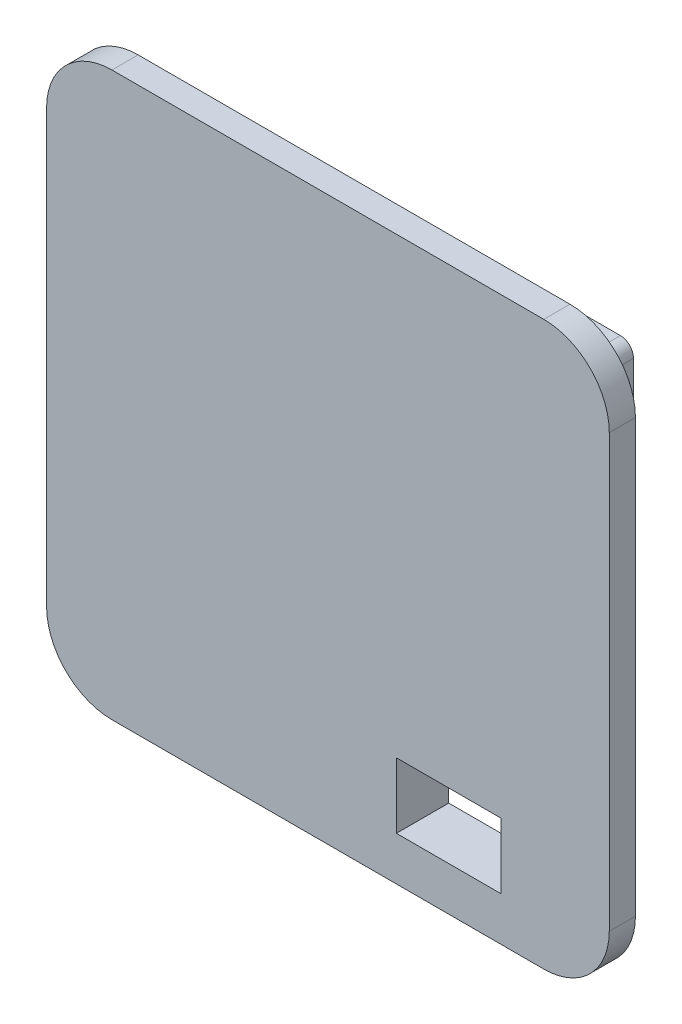
ISO-10303-21;
HEADER;
FILE_DESCRIPTION(('STEP AP214'),'2;1');
FILE_NAME('part.step','',(''),(''),'','','');
FILE_SCHEMA(('AUTOMOTIVE_DESIGN { 1 0 10303 214 1 1 1 1 }'));
ENDSEC;
DATA;
#1=APPLICATION_CONTEXT('core data for automotive mechanical design processes');
#2=APPLICATION_PROTOCOL_DEFINITION('international standard','automotive_design',2000,#1);
#3=PRODUCT_CONTEXT('',#1,'mechanical');
#4=PRODUCT('Part','Part','',(#3));
#5=PRODUCT_RELATED_PRODUCT_CATEGORY('part','',(#4));
#6=PRODUCT_DEFINITION_FORMATION('','',#4);
#7=PRODUCT_DEFINITION_CONTEXT('part definition',#1,'design');
#8=PRODUCT_DEFINITION('design','',#6,#7);
#9=PRODUCT_DEFINITION_SHAPE('','',#8);
#10=(LENGTH_UNIT() NAMED_UNIT(*) SI_UNIT(.MILLI.,.METRE.));
#11=(NAMED_UNIT(*) PLANE_ANGLE_UNIT() SI_UNIT($,.RADIAN.));
#12=(NAMED_UNIT(*) SI_UNIT($,.STERADIAN.) SOLID_ANGLE_UNIT());
#13=UNCERTAINTY_MEASURE_WITH_UNIT(LENGTH_MEASURE(1.E-05),#10,'distance_accuracy_value','');
#14=(GEOMETRIC_REPRESENTATION_CONTEXT(3) GLOBAL_UNCERTAINTY_ASSIGNED_CONTEXT((#13)) GLOBAL_UNIT_ASSIGNED_CONTEXT((#10,
#11,#12)) REPRESENTATION_CONTEXT('',''));
#15=CARTESIAN_POINT('',(0.,0.,0.));
#16=DIRECTION('',(0.,0.,1.));
#17=DIRECTION('',(1.,0.,0.));
#18=AXIS2_PLACEMENT_3D('',#15,#16,#17);
#19=CARTESIAN_POINT('',(21.5,-21.500000053,2.));
#20=DIRECTION('',(0.,1.,0.));
#21=DIRECTION('',(0.,0.,1.));
#22=AXIS2_PLACEMENT_3D('',#19,#20,#21);
#23=PLANE('',#22);
#24=DIRECTION('',(1.,0.,0.));
#25=VECTOR('',#24,1.);
#26=CARTESIAN_POINT('',(21.5,-21.500000053,0.));
#27=LINE('',#26,#25);
#28=CARTESIAN_POINT('',(-16.5,-21.500000053,0.));
#29=VERTEX_POINT('',#28);
#30=CARTESIAN_POINT('',(16.5,-21.500000053,0.));
#31=VERTEX_POINT('',#30);
#32=EDGE_CURVE('E231',#29,#31,#27,.T.);
#33=ORIENTED_EDGE('',*,*,#32,.T.);
#34=DIRECTION('',(0.,0.,-1.));
#35=VECTOR('',#34,1.);
#36=CARTESIAN_POINT('',(16.5,-21.500000053,2.));
#37=LINE('',#36,#35);
#38=CARTESIAN_POINT('',(16.5,-21.500000053,2.));
#39=VERTEX_POINT('',#38);
#40=EDGE_CURVE('E274',#31,#39,#37,.F.);
#41=ORIENTED_EDGE('',*,*,#40,.T.);
#42=DIRECTION('',(1.,0.,0.));
#43=VECTOR('',#42,1.);
#44=CARTESIAN_POINT('',(21.5,-21.500000053,2.));
#45=LINE('',#44,#43);
#46=CARTESIAN_POINT('',(-16.5,-21.500000053,2.));
#47=VERTEX_POINT('',#46);
#48=EDGE_CURVE('E237',#47,#39,#45,.T.);
#49=ORIENTED_EDGE('',*,*,#48,.F.);
#50=DIRECTION('',(0.,0.,-1.));
#51=VECTOR('',#50,1.);
#52=CARTESIAN_POINT('',(-16.5,-21.500000053,2.));
#53=LINE('',#52,#51);
#54=EDGE_CURVE('E275',#47,#29,#53,.T.);
#55=ORIENTED_EDGE('',*,*,#54,.T.);
#56=EDGE_LOOP('',(#33,#41,#49,#55));
#57=FACE_BOUND('',#56,.T.);
#58=ADVANCED_FACE('F41',(#57),#23,.F.);
#59=CARTESIAN_POINT('',(21.5,21.500000053,2.));
#60=DIRECTION('',(-1.,0.,0.));
#61=DIRECTION('',(0.,-1.,0.));
#62=AXIS2_PLACEMENT_3D('',#59,#60,#61);
#63=PLANE('',#62);
#64=DIRECTION('',(0.,1.,0.));
#65=VECTOR('',#64,1.);
#66=CARTESIAN_POINT('',(21.5,21.500000053,2.));
#67=LINE('',#66,#65);
#68=CARTESIAN_POINT('',(21.5,-16.500000053,2.));
#69=VERTEX_POINT('',#68);
#70=CARTESIAN_POINT('',(21.5,16.500000053,2.));
#71=VERTEX_POINT('',#70);
#72=EDGE_CURVE('E239',#69,#71,#67,.T.);
#73=ORIENTED_EDGE('',*,*,#72,.F.);
#74=DIRECTION('',(0.,0.,-1.));
#75=VECTOR('',#74,1.);
#76=CARTESIAN_POINT('',(21.5,-16.500000053,2.));
#77=LINE('',#76,#75);
#78=CARTESIAN_POINT('',(21.5,-16.500000053,0.));
#79=VERTEX_POINT('',#78);
#80=EDGE_CURVE('E261',#69,#79,#77,.T.);
#81=ORIENTED_EDGE('',*,*,#80,.T.);
#82=DIRECTION('',(0.,1.,0.));
#83=VECTOR('',#82,1.);
#84=CARTESIAN_POINT('',(21.5,21.500000053,0.));
#85=LINE('',#84,#83);
#86=CARTESIAN_POINT('',(21.5,16.500000053,0.));
#87=VERTEX_POINT('',#86);
#88=EDGE_CURVE('E252',#79,#87,#85,.T.);
#89=ORIENTED_EDGE('',*,*,#88,.T.);
#90=DIRECTION('',(0.,0.,-1.));
#91=VECTOR('',#90,1.);
#92=CARTESIAN_POINT('',(21.5,16.500000053,2.));
#93=LINE('',#92,#91);
#94=EDGE_CURVE('E248',#87,#71,#93,.F.);
#95=ORIENTED_EDGE('',*,*,#94,.T.);
#96=EDGE_LOOP('',(#73,#81,#89,#95));
#97=FACE_BOUND('',#96,.T.);
#98=ADVANCED_FACE('F374',(#97),#63,.F.);
#99=CARTESIAN_POINT('',(21.5,21.500000053,2.));
#100=DIRECTION('',(0.,-1.,0.));
#101=DIRECTION('',(0.,0.,-1.));
#102=AXIS2_PLACEMENT_3D('',#99,#100,#101);
#103=PLANE('',#102);
#104=DIRECTION('',(-1.,0.,0.));
#105=VECTOR('',#104,1.);
#106=CARTESIAN_POINT('',(21.5,21.500000053,0.));
#107=LINE('',#106,#105);
#108=CARTESIAN_POINT('',(16.5,21.500000053,0.));
#109=VERTEX_POINT('',#108);
#110=CARTESIAN_POINT('',(-16.5,21.500000053,0.));
#111=VERTEX_POINT('',#110);
#112=EDGE_CURVE('E254',#109,#111,#107,.T.);
#113=ORIENTED_EDGE('',*,*,#112,.T.);
#114=DIRECTION('',(0.,0.,-1.));
#115=VECTOR('',#114,1.);
#116=CARTESIAN_POINT('',(-16.5,21.500000053,2.));
#117=LINE('',#116,#115);
#118=CARTESIAN_POINT('',(-16.5,21.500000053,2.));
#119=VERTEX_POINT('',#118);
#120=EDGE_CURVE('E291',#111,#119,#117,.F.);
#121=ORIENTED_EDGE('',*,*,#120,.T.);
#122=DIRECTION('',(-1.,0.,0.));
#123=VECTOR('',#122,1.);
#124=CARTESIAN_POINT('',(21.5,21.500000053,2.));
#125=LINE('',#124,#123);
#126=CARTESIAN_POINT('',(16.5,21.500000053,2.));
#127=VERTEX_POINT('',#126);
#128=EDGE_CURVE('E241',#127,#119,#125,.T.);
#129=ORIENTED_EDGE('',*,*,#128,.F.);
#130=DIRECTION('',(0.,0.,-1.));
#131=VECTOR('',#130,1.);
#132=CARTESIAN_POINT('',(16.5,21.500000053,2.));
#133=LINE('',#132,#131);
#134=EDGE_CURVE('E289',#127,#109,#133,.T.);
#135=ORIENTED_EDGE('',*,*,#134,.T.);
#136=EDGE_LOOP('',(#113,#121,#129,#135));
#137=FACE_BOUND('',#136,.T.);
#138=ADVANCED_FACE('F381',(#137),#103,.F.);
#139=CARTESIAN_POINT('',(-21.5,21.500000053,2.));
#140=DIRECTION('',(1.,0.,0.));
#141=DIRECTION('',(0.,1.,0.));
#142=AXIS2_PLACEMENT_3D('',#139,#140,#141);
#143=PLANE('',#142);
#144=DIRECTION('',(0.,-1.,0.));
#145=VECTOR('',#144,1.);
#146=CARTESIAN_POINT('',(-21.5,21.500000053,0.));
#147=LINE('',#146,#145);
#148=CARTESIAN_POINT('',(-21.5,16.500000053,0.));
#149=VERTEX_POINT('',#148);
#150=CARTESIAN_POINT('',(-21.5,-16.500000053,0.));
#151=VERTEX_POINT('',#150);
#152=EDGE_CURVE('E238',#149,#151,#147,.T.);
#153=ORIENTED_EDGE('',*,*,#152,.T.);
#154=DIRECTION('',(0.,0.,-1.));
#155=VECTOR('',#154,1.);
#156=CARTESIAN_POINT('',(-21.5,-16.500000053,2.));
#157=LINE('',#156,#155);
#158=CARTESIAN_POINT('',(-21.5,-16.500000053,2.));
#159=VERTEX_POINT('',#158);
#160=EDGE_CURVE('E287',#151,#159,#157,.F.);
#161=ORIENTED_EDGE('',*,*,#160,.T.);
#162=DIRECTION('',(0.,-1.,0.));
#163=VECTOR('',#162,1.);
#164=CARTESIAN_POINT('',(-21.5,21.500000053,2.));
#165=LINE('',#164,#163);
#166=CARTESIAN_POINT('',(-21.5,16.500000053,2.));
#167=VERTEX_POINT('',#166);
#168=EDGE_CURVE('E246',#167,#159,#165,.T.);
#169=ORIENTED_EDGE('',*,*,#168,.F.);
#170=DIRECTION('',(0.,0.,-1.));
#171=VECTOR('',#170,1.);
#172=CARTESIAN_POINT('',(-21.5,16.500000053,2.));
#173=LINE('',#172,#171);
#174=EDGE_CURVE('E282',#167,#149,#173,.T.);
#175=ORIENTED_EDGE('',*,*,#174,.T.);
#176=EDGE_LOOP('',(#153,#161,#169,#175));
#177=FACE_BOUND('',#176,.T.);
#178=ADVANCED_FACE('F425',(#177),#143,.F.);
#179=CARTESIAN_POINT('',(0.,0.,2.));
#180=DIRECTION('',(0.,0.,1.));
#181=DIRECTION('',(1.,0.,0.));
#182=AXIS2_PLACEMENT_3D('',#179,#180,#181);
#183=PLANE('',#182);
#184=DIRECTION('',(0.,-1.,0.));
#185=VECTOR('',#184,1.);
#186=CARTESIAN_POINT('',(5.23212130139682,-18.14808421376,2.));
#187=LINE('',#186,#185);
#188=CARTESIAN_POINT('',(5.23212130139682,-13.14808421376,2.));
#189=VERTEX_POINT('',#188);
#190=CARTESIAN_POINT('',(5.23212130139682,-18.14808421376,2.));
#191=VERTEX_POINT('',#190);
#192=EDGE_CURVE('E211',#189,#191,#187,.T.);
#193=ORIENTED_EDGE('',*,*,#192,.F.);
#194=DIRECTION('',(-1.,0.,0.));
#195=VECTOR('',#194,1.);
#196=CARTESIAN_POINT('',(13.2321213013968,-13.14808421376,2.));
#197=LINE('',#196,#195);
#198=CARTESIAN_POINT('',(13.2321213013968,-13.14808421376,2.));
#199=VERTEX_POINT('',#198);
#200=EDGE_CURVE('E226',#199,#189,#197,.T.);
#201=ORIENTED_EDGE('',*,*,#200,.F.);
#202=DIRECTION('',(0.,1.,0.));
#203=VECTOR('',#202,1.);
#204=CARTESIAN_POINT('',(13.2321213013968,-18.14808421376,2.));
#205=LINE('',#204,#203);
#206=CARTESIAN_POINT('',(13.2321213013968,-18.14808421376,2.));
#207=VERTEX_POINT('',#206);
#208=EDGE_CURVE('E181',#207,#199,#205,.T.);
#209=ORIENTED_EDGE('',*,*,#208,.F.);
#210=DIRECTION('',(1.,0.,0.));
#211=VECTOR('',#210,1.);
#212=CARTESIAN_POINT('',(13.2321213013968,-18.14808421376,2.));
#213=LINE('',#212,#211);
#214=EDGE_CURVE('E221',#191,#207,#213,.T.);
#215=ORIENTED_EDGE('',*,*,#214,.F.);
#216=EDGE_LOOP('',(#193,#201,#209,#215));
#217=FACE_BOUND('',#216,.T.);
#218=ORIENTED_EDGE('',*,*,#48,.T.);
#219=CARTESIAN_POINT('',(16.5,-16.500000053,2.));
#220=DIRECTION('',(0.,0.,1.));
#221=DIRECTION('',(1.,0.,0.));
#222=AXIS2_PLACEMENT_3D('',#219,#220,#221);
#223=CIRCLE('',#222,5.);
#224=EDGE_CURVE('E281',#39,#69,#223,.T.);
#225=ORIENTED_EDGE('',*,*,#224,.T.);
#226=ORIENTED_EDGE('',*,*,#72,.T.);
#227=CARTESIAN_POINT('',(16.5,16.500000053,2.));
#228=DIRECTION('',(0.,0.,1.));
#229=DIRECTION('',(1.,0.,0.));
#230=AXIS2_PLACEMENT_3D('',#227,#228,#229);
#231=CIRCLE('',#230,5.);
#232=EDGE_CURVE('E280',#71,#127,#231,.T.);
#233=ORIENTED_EDGE('',*,*,#232,.T.);
#234=ORIENTED_EDGE('',*,*,#128,.T.);
#235=CARTESIAN_POINT('',(-16.5,16.500000053,2.));
#236=DIRECTION('',(0.,0.,1.));
#237=DIRECTION('',(1.,0.,0.));
#238=AXIS2_PLACEMENT_3D('',#235,#236,#237);
#239=CIRCLE('',#238,5.);
#240=EDGE_CURVE('E276',#119,#167,#239,.T.);
#241=ORIENTED_EDGE('',*,*,#240,.T.);
#242=ORIENTED_EDGE('',*,*,#168,.T.);
#243=CARTESIAN_POINT('',(-16.5,-16.500000053,2.));
#244=DIRECTION('',(0.,0.,1.));
#245=DIRECTION('',(1.,0.,0.));
#246=AXIS2_PLACEMENT_3D('',#243,#244,#245);
#247=CIRCLE('',#246,5.);
#248=EDGE_CURVE('E283',#159,#47,#247,.T.);
#249=ORIENTED_EDGE('',*,*,#248,.T.);
#250=EDGE_LOOP('',(#218,#225,#226,#233,#234,#241,#242,#249));
#251=FACE_BOUND('',#250,.T.);
#252=ADVANCED_FACE('F415',(#217,#251),#183,.T.);
#253=CARTESIAN_POINT('',(0.,0.,0.));
#254=DIRECTION('',(0.,0.,1.));
#255=DIRECTION('',(1.,0.,0.));
#256=AXIS2_PLACEMENT_3D('',#253,#254,#255);
#257=PLANE('',#256);
#258=DIRECTION('',(1.,0.,0.));
#259=VECTOR('',#258,1.);
#260=CARTESIAN_POINT('',(0.,19.35,0.));
#261=LINE('',#260,#259);
#262=CARTESIAN_POINT('',(-18.35,19.35,0.));
#263=VERTEX_POINT('',#262);
#264=CARTESIAN_POINT('',(18.35,19.35,0.));
#265=VERTEX_POINT('',#264);
#266=EDGE_CURVE('E212',#263,#265,#261,.T.);
#267=ORIENTED_EDGE('',*,*,#266,.F.);
#268=CARTESIAN_POINT('',(-18.35,18.35,0.));
#269=DIRECTION('',(0.,0.,1.));
#270=DIRECTION('',(1.,0.,0.));
#271=AXIS2_PLACEMENT_3D('',#268,#269,#270);
#272=CIRCLE('',#271,1.);
#273=CARTESIAN_POINT('',(-19.35,18.35,0.));
#274=VERTEX_POINT('',#273);
#275=EDGE_CURVE('E325',#263,#274,#272,.T.);
#276=ORIENTED_EDGE('',*,*,#275,.T.);
#277=DIRECTION('',(0.,-1.,0.));
#278=VECTOR('',#277,1.);
#279=CARTESIAN_POINT('',(-19.35,0.,0.));
#280=LINE('',#279,#278);
#281=CARTESIAN_POINT('',(-19.35,-18.35,0.));
#282=VERTEX_POINT('',#281);
#283=EDGE_CURVE('E215',#274,#282,#280,.T.);
#284=ORIENTED_EDGE('',*,*,#283,.T.);
#285=CARTESIAN_POINT('',(-18.35,-18.35,0.));
#286=DIRECTION('',(0.,0.,1.));
#287=DIRECTION('',(1.,0.,0.));
#288=AXIS2_PLACEMENT_3D('',#285,#286,#287);
#289=CIRCLE('',#288,1.);
#290=CARTESIAN_POINT('',(-18.35,-19.35,0.));
#291=VERTEX_POINT('',#290);
#292=EDGE_CURVE('E11',#282,#291,#289,.T.);
#293=ORIENTED_EDGE('',*,*,#292,.T.);
#294=DIRECTION('',(1.,0.,0.));
#295=VECTOR('',#294,1.);
#296=CARTESIAN_POINT('',(0.,-19.35,0.));
#297=LINE('',#296,#295);
#298=CARTESIAN_POINT('',(18.35,-19.35,0.));
#299=VERTEX_POINT('',#298);
#300=EDGE_CURVE('E219',#291,#299,#297,.T.);
#301=ORIENTED_EDGE('',*,*,#300,.T.);
#302=CARTESIAN_POINT('',(18.35,-18.35,0.));
#303=DIRECTION('',(0.,0.,1.));
#304=DIRECTION('',(1.,0.,0.));
#305=AXIS2_PLACEMENT_3D('',#302,#303,#304);
#306=CIRCLE('',#305,1.);
#307=CARTESIAN_POINT('',(19.35,-18.35,0.));
#308=VERTEX_POINT('',#307);
#309=EDGE_CURVE('E47',#299,#308,#306,.T.);
#310=ORIENTED_EDGE('',*,*,#309,.T.);
#311=DIRECTION('',(0.,-1.,0.));
#312=VECTOR('',#311,1.);
#313=CARTESIAN_POINT('',(19.35,0.,0.));
#314=LINE('',#313,#312);
#315=CARTESIAN_POINT('',(19.35,18.35,0.));
#316=VERTEX_POINT('',#315);
#317=EDGE_CURVE('E220',#316,#308,#314,.T.);
#318=ORIENTED_EDGE('',*,*,#317,.F.);
#319=CARTESIAN_POINT('',(18.35,18.35,0.));
#320=DIRECTION('',(0.,0.,1.));
#321=DIRECTION('',(1.,0.,0.));
#322=AXIS2_PLACEMENT_3D('',#319,#320,#321);
#323=CIRCLE('',#322,1.);
#324=EDGE_CURVE('E322',#316,#265,#323,.T.);
#325=ORIENTED_EDGE('',*,*,#324,.T.);
#326=EDGE_LOOP('',(#267,#276,#284,#293,#301,#310,#318,#325));
#327=FACE_BOUND('',#326,.T.);
#328=ORIENTED_EDGE('',*,*,#88,.F.);
#329=CARTESIAN_POINT('',(16.5,-16.500000053,0.));
#330=DIRECTION('',(0.,0.,1.));
#331=DIRECTION('',(1.,0.,0.));
#332=AXIS2_PLACEMENT_3D('',#329,#330,#331);
#333=CIRCLE('',#332,5.);
#334=EDGE_CURVE('E269',#79,#31,#333,.F.);
#335=ORIENTED_EDGE('',*,*,#334,.T.);
#336=ORIENTED_EDGE('',*,*,#32,.F.);
#337=CARTESIAN_POINT('',(-16.5,-16.500000053,0.));
#338=DIRECTION('',(0.,0.,1.));
#339=DIRECTION('',(1.,0.,0.));
#340=AXIS2_PLACEMENT_3D('',#337,#338,#339);
#341=CIRCLE('',#340,5.);
#342=EDGE_CURVE('E268',#29,#151,#341,.F.);
#343=ORIENTED_EDGE('',*,*,#342,.T.);
#344=ORIENTED_EDGE('',*,*,#152,.F.);
#345=CARTESIAN_POINT('',(-16.5,16.500000053,0.));
#346=DIRECTION('',(0.,0.,1.));
#347=DIRECTION('',(1.,0.,0.));
#348=AXIS2_PLACEMENT_3D('',#345,#346,#347);
#349=CIRCLE('',#348,5.);
#350=EDGE_CURVE('E266',#149,#111,#349,.F.);
#351=ORIENTED_EDGE('',*,*,#350,.T.);
#352=ORIENTED_EDGE('',*,*,#112,.F.);
#353=CARTESIAN_POINT('',(16.5,16.500000053,0.));
#354=DIRECTION('',(0.,0.,1.));
#355=DIRECTION('',(1.,0.,0.));
#356=AXIS2_PLACEMENT_3D('',#353,#354,#355);
#357=CIRCLE('',#356,5.);
#358=EDGE_CURVE('E262',#109,#87,#357,.F.);
#359=ORIENTED_EDGE('',*,*,#358,.T.);
#360=EDGE_LOOP('',(#328,#335,#336,#343,#344,#351,#352,#359));
#361=FACE_BOUND('',#360,.T.);
#362=ADVANCED_FACE('F330',(#327,#361),#257,.F.);
#363=CARTESIAN_POINT('',(16.5,-16.500000053,2.));
#364=DIRECTION('',(0.,0.,-1.));
#365=DIRECTION('',(-1.,0.,0.));
#366=AXIS2_PLACEMENT_3D('',#363,#364,#365);
#367=CYLINDRICAL_SURFACE('',#366,5.);
#368=ORIENTED_EDGE('',*,*,#224,.F.);
#369=ORIENTED_EDGE('',*,*,#40,.F.);
#370=ORIENTED_EDGE('',*,*,#334,.F.);
#371=ORIENTED_EDGE('',*,*,#80,.F.);
#372=EDGE_LOOP('',(#368,#369,#370,#371));
#373=FACE_BOUND('',#372,.T.);
#374=ADVANCED_FACE('F387',(#373),#367,.T.);
#375=CARTESIAN_POINT('',(-16.5,-16.500000053,2.));
#376=DIRECTION('',(0.,0.,-1.));
#377=DIRECTION('',(-1.,0.,0.));
#378=AXIS2_PLACEMENT_3D('',#375,#376,#377);
#379=CYLINDRICAL_SURFACE('',#378,5.);
#380=ORIENTED_EDGE('',*,*,#248,.F.);
#381=ORIENTED_EDGE('',*,*,#160,.F.);
#382=ORIENTED_EDGE('',*,*,#342,.F.);
#383=ORIENTED_EDGE('',*,*,#54,.F.);
#384=EDGE_LOOP('',(#380,#381,#382,#383));
#385=FACE_BOUND('',#384,.T.);
#386=ADVANCED_FACE('F386',(#385),#379,.T.);
#387=CARTESIAN_POINT('',(-16.5,16.500000053,2.));
#388=DIRECTION('',(0.,0.,-1.));
#389=DIRECTION('',(-1.,0.,0.));
#390=AXIS2_PLACEMENT_3D('',#387,#388,#389);
#391=CYLINDRICAL_SURFACE('',#390,5.);
#392=ORIENTED_EDGE('',*,*,#240,.F.);
#393=ORIENTED_EDGE('',*,*,#120,.F.);
#394=ORIENTED_EDGE('',*,*,#350,.F.);
#395=ORIENTED_EDGE('',*,*,#174,.F.);
#396=EDGE_LOOP('',(#392,#393,#394,#395));
#397=FACE_BOUND('',#396,.T.);
#398=ADVANCED_FACE('F391',(#397),#391,.T.);
#399=CARTESIAN_POINT('',(16.5,16.500000053,2.));
#400=DIRECTION('',(0.,0.,-1.));
#401=DIRECTION('',(-1.,0.,0.));
#402=AXIS2_PLACEMENT_3D('',#399,#400,#401);
#403=CYLINDRICAL_SURFACE('',#402,5.);
#404=ORIENTED_EDGE('',*,*,#232,.F.);
#405=ORIENTED_EDGE('',*,*,#94,.F.);
#406=ORIENTED_EDGE('',*,*,#358,.F.);
#407=ORIENTED_EDGE('',*,*,#134,.F.);
#408=EDGE_LOOP('',(#404,#405,#406,#407));
#409=FACE_BOUND('',#408,.T.);
#410=ADVANCED_FACE('F396',(#409),#403,.T.);
#411=CARTESIAN_POINT('',(5.23212130139682,-18.14808421376,0.));
#412=DIRECTION('',(-1.,0.,0.));
#413=DIRECTION('',(0.,0.,1.));
#414=AXIS2_PLACEMENT_3D('',#411,#412,#413);
#415=PLANE('',#414);
#416=ORIENTED_EDGE('',*,*,#192,.T.);
#417=DIRECTION('',(0.,0.,1.));
#418=VECTOR('',#417,1.);
#419=CARTESIAN_POINT('',(5.23212130139682,-18.14808421376,0.));
#420=LINE('',#419,#418);
#421=CARTESIAN_POINT('',(5.23212130139682,-18.14808421376,-2.));
#422=VERTEX_POINT('',#421);
#423=EDGE_CURVE('E227',#422,#191,#420,.T.);
#424=ORIENTED_EDGE('',*,*,#423,.F.);
#425=DIRECTION('',(0.,-1.,0.));
#426=VECTOR('',#425,1.);
#427=CARTESIAN_POINT('',(5.23212130139682,0.,-2.));
#428=LINE('',#427,#426);
#429=CARTESIAN_POINT('',(5.23212130139682,-13.14808421376,-2.));
#430=VERTEX_POINT('',#429);
#431=EDGE_CURVE('E198',#430,#422,#428,.T.);
#432=ORIENTED_EDGE('',*,*,#431,.F.);
#433=DIRECTION('',(0.,0.,1.));
#434=VECTOR('',#433,1.);
#435=CARTESIAN_POINT('',(5.23212130139682,-13.14808421376,0.));
#436=LINE('',#435,#434);
#437=EDGE_CURVE('E190',#430,#189,#436,.T.);
#438=ORIENTED_EDGE('',*,*,#437,.T.);
#439=EDGE_LOOP('',(#416,#424,#432,#438));
#440=FACE_BOUND('',#439,.T.);
#441=ADVANCED_FACE('F398',(#440),#415,.F.);
#442=CARTESIAN_POINT('',(13.2321213013968,-13.14808421376,0.));
#443=DIRECTION('',(0.,1.,0.));
#444=DIRECTION('',(-1.,0.,0.));
#445=AXIS2_PLACEMENT_3D('',#442,#443,#444);
#446=PLANE('',#445);
#447=ORIENTED_EDGE('',*,*,#200,.T.);
#448=ORIENTED_EDGE('',*,*,#437,.F.);
#449=DIRECTION('',(-1.,0.,0.));
#450=VECTOR('',#449,1.);
#451=CARTESIAN_POINT('',(0.,-13.14808421376,-2.));
#452=LINE('',#451,#450);
#453=CARTESIAN_POINT('',(13.2321213013968,-13.14808421376,-2.));
#454=VERTEX_POINT('',#453);
#455=EDGE_CURVE('E191',#454,#430,#452,.T.);
#456=ORIENTED_EDGE('',*,*,#455,.F.);
#457=DIRECTION('',(0.,0.,1.));
#458=VECTOR('',#457,1.);
#459=CARTESIAN_POINT('',(13.2321213013968,-13.14808421376,0.));
#460=LINE('',#459,#458);
#461=EDGE_CURVE('E180',#454,#199,#460,.T.);
#462=ORIENTED_EDGE('',*,*,#461,.T.);
#463=EDGE_LOOP('',(#447,#448,#456,#462));
#464=FACE_BOUND('',#463,.T.);
#465=ADVANCED_FACE('F195',(#464),#446,.F.);
#466=CARTESIAN_POINT('',(13.2321213013968,-18.14808421376,0.));
#467=DIRECTION('',(1.,0.,0.));
#468=DIRECTION('',(0.,0.,-1.));
#469=AXIS2_PLACEMENT_3D('',#466,#467,#468);
#470=PLANE('',#469);
#471=ORIENTED_EDGE('',*,*,#208,.T.);
#472=ORIENTED_EDGE('',*,*,#461,.F.);
#473=DIRECTION('',(0.,1.,0.));
#474=VECTOR('',#473,1.);
#475=CARTESIAN_POINT('',(13.2321213013968,0.,-2.));
#476=LINE('',#475,#474);
#477=CARTESIAN_POINT('',(13.2321213013968,-18.14808421376,-2.));
#478=VERTEX_POINT('',#477);
#479=EDGE_CURVE('E182',#478,#454,#476,.T.);
#480=ORIENTED_EDGE('',*,*,#479,.F.);
#481=DIRECTION('',(0.,0.,1.));
#482=VECTOR('',#481,1.);
#483=CARTESIAN_POINT('',(13.2321213013968,-18.14808421376,0.));
#484=LINE('',#483,#482);
#485=EDGE_CURVE('E186',#478,#207,#484,.T.);
#486=ORIENTED_EDGE('',*,*,#485,.T.);
#487=EDGE_LOOP('',(#471,#472,#480,#486));
#488=FACE_BOUND('',#487,.T.);
#489=ADVANCED_FACE('F178',(#488),#470,.F.);
#490=CARTESIAN_POINT('',(13.2321213013968,-18.14808421376,0.));
#491=DIRECTION('',(0.,-1.,0.));
#492=DIRECTION('',(0.,0.,-1.));
#493=AXIS2_PLACEMENT_3D('',#490,#491,#492);
#494=PLANE('',#493);
#495=ORIENTED_EDGE('',*,*,#214,.T.);
#496=ORIENTED_EDGE('',*,*,#485,.F.);
#497=DIRECTION('',(1.,0.,0.));
#498=VECTOR('',#497,1.);
#499=CARTESIAN_POINT('',(0.,-18.14808421376,-2.));
#500=LINE('',#499,#498);
#501=EDGE_CURVE('E203',#422,#478,#500,.T.);
#502=ORIENTED_EDGE('',*,*,#501,.F.);
#503=ORIENTED_EDGE('',*,*,#423,.T.);
#504=EDGE_LOOP('',(#495,#496,#502,#503));
#505=FACE_BOUND('',#504,.T.);
#506=ADVANCED_FACE('F503',(#505),#494,.F.);
#507=CARTESIAN_POINT('',(-19.35,0.,-2.));
#508=DIRECTION('',(-1.,0.,0.));
#509=DIRECTION('',(0.,-1.,0.));
#510=AXIS2_PLACEMENT_3D('',#507,#508,#509);
#511=PLANE('',#510);
#512=ORIENTED_EDGE('',*,*,#283,.F.);
#513=DIRECTION('',(0.,0.,1.));
#514=VECTOR('',#513,1.);
#515=CARTESIAN_POINT('',(-19.35,18.35,-2.));
#516=LINE('',#515,#514);
#517=CARTESIAN_POINT('',(-19.35,18.35,-2.));
#518=VERTEX_POINT('',#517);
#519=EDGE_CURVE('E302',#274,#518,#516,.F.);
#520=ORIENTED_EDGE('',*,*,#519,.T.);
#521=DIRECTION('',(0.,-1.,0.));
#522=VECTOR('',#521,1.);
#523=CARTESIAN_POINT('',(-19.35,0.,-2.));
#524=LINE('',#523,#522);
#525=CARTESIAN_POINT('',(-19.35,-18.35,-2.));
#526=VERTEX_POINT('',#525);
#527=EDGE_CURVE('E225',#518,#526,#524,.T.);
#528=ORIENTED_EDGE('',*,*,#527,.T.);
#529=DIRECTION('',(0.,0.,1.));
#530=VECTOR('',#529,1.);
#531=CARTESIAN_POINT('',(-19.35,-18.35,-2.));
#532=LINE('',#531,#530);
#533=EDGE_CURVE('E297',#526,#282,#532,.T.);
#534=ORIENTED_EDGE('',*,*,#533,.T.);
#535=EDGE_LOOP('',(#512,#520,#528,#534));
#536=FACE_BOUND('',#535,.T.);
#537=ADVANCED_FACE('F349',(#536),#511,.T.);
#538=CARTESIAN_POINT('',(0.,19.35,-2.));
#539=DIRECTION('',(0.,-1.,0.));
#540=DIRECTION('',(0.,0.,-1.));
#541=AXIS2_PLACEMENT_3D('',#538,#539,#540);
#542=PLANE('',#541);
#543=DIRECTION('',(1.,0.,0.));
#544=VECTOR('',#543,1.);
#545=CARTESIAN_POINT('',(0.,19.35,-2.));
#546=LINE('',#545,#544);
#547=CARTESIAN_POINT('',(-18.35,19.35,-2.));
#548=VERTEX_POINT('',#547);
#549=CARTESIAN_POINT('',(18.35,19.35,-2.));
#550=VERTEX_POINT('',#549);
#551=EDGE_CURVE('E353',#548,#550,#546,.T.);
#552=ORIENTED_EDGE('',*,*,#551,.F.);
#553=DIRECTION('',(0.,0.,1.));
#554=VECTOR('',#553,1.);
#555=CARTESIAN_POINT('',(-18.35,19.35,0.));
#556=LINE('',#555,#554);
#557=EDGE_CURVE('E300',#548,#263,#556,.T.);
#558=ORIENTED_EDGE('',*,*,#557,.T.);
#559=ORIENTED_EDGE('',*,*,#266,.T.);
#560=DIRECTION('',(0.,0.,1.));
#561=VECTOR('',#560,1.);
#562=CARTESIAN_POINT('',(18.35,19.35,-2.));
#563=LINE('',#562,#561);
#564=EDGE_CURVE('E293',#265,#550,#563,.F.);
#565=ORIENTED_EDGE('',*,*,#564,.T.);
#566=EDGE_LOOP('',(#552,#558,#559,#565));
#567=FACE_BOUND('',#566,.T.);
#568=ADVANCED_FACE('F362',(#567),#542,.F.);
#569=CARTESIAN_POINT('',(19.35,0.,-2.));
#570=DIRECTION('',(-1.,0.,0.));
#571=DIRECTION('',(0.,-1.,0.));
#572=AXIS2_PLACEMENT_3D('',#569,#570,#571);
#573=PLANE('',#572);
#574=DIRECTION('',(0.,-1.,0.));
#575=VECTOR('',#574,1.);
#576=CARTESIAN_POINT('',(19.35,0.,-2.));
#577=LINE('',#576,#575);
#578=CARTESIAN_POINT('',(19.35,18.35,-2.));
#579=VERTEX_POINT('',#578);
#580=CARTESIAN_POINT('',(19.35,-18.35,-2.));
#581=VERTEX_POINT('',#580);
#582=EDGE_CURVE('E202',#579,#581,#577,.T.);
#583=ORIENTED_EDGE('',*,*,#582,.F.);
#584=DIRECTION('',(0.,0.,1.));
#585=VECTOR('',#584,1.);
#586=CARTESIAN_POINT('',(19.35,18.35,-2.));
#587=LINE('',#586,#585);
#588=EDGE_CURVE('E312',#579,#316,#587,.T.);
#589=ORIENTED_EDGE('',*,*,#588,.T.);
#590=ORIENTED_EDGE('',*,*,#317,.T.);
#591=DIRECTION('',(0.,0.,1.));
#592=VECTOR('',#591,1.);
#593=CARTESIAN_POINT('',(19.35,-18.35,-2.));
#594=LINE('',#593,#592);
#595=EDGE_CURVE('E311',#308,#581,#594,.F.);
#596=ORIENTED_EDGE('',*,*,#595,.T.);
#597=EDGE_LOOP('',(#583,#589,#590,#596));
#598=FACE_BOUND('',#597,.T.);
#599=ADVANCED_FACE('F332',(#598),#573,.F.);
#600=CARTESIAN_POINT('',(0.,-19.35,-2.));
#601=DIRECTION('',(0.,-1.,0.));
#602=DIRECTION('',(1.,0.,0.));
#603=AXIS2_PLACEMENT_3D('',#600,#601,#602);
#604=PLANE('',#603);
#605=DIRECTION('',(1.,0.,0.));
#606=VECTOR('',#605,1.);
#607=CARTESIAN_POINT('',(0.,-19.35,-2.));
#608=LINE('',#607,#606);
#609=CARTESIAN_POINT('',(-18.35,-19.35,-2.));
#610=VERTEX_POINT('',#609);
#611=CARTESIAN_POINT('',(18.35,-19.35,-2.));
#612=VERTEX_POINT('',#611);
#613=EDGE_CURVE('E205',#610,#612,#608,.T.);
#614=ORIENTED_EDGE('',*,*,#613,.T.);
#615=DIRECTION('',(0.,0.,1.));
#616=VECTOR('',#615,1.);
#617=CARTESIAN_POINT('',(18.35,-19.35,0.));
#618=LINE('',#617,#616);
#619=EDGE_CURVE('E319',#612,#299,#618,.T.);
#620=ORIENTED_EDGE('',*,*,#619,.T.);
#621=ORIENTED_EDGE('',*,*,#300,.F.);
#622=DIRECTION('',(0.,0.,1.));
#623=VECTOR('',#622,1.);
#624=CARTESIAN_POINT('',(-18.35,-19.35,-2.));
#625=LINE('',#624,#623);
#626=EDGE_CURVE('E318',#291,#610,#625,.F.);
#627=ORIENTED_EDGE('',*,*,#626,.T.);
#628=EDGE_LOOP('',(#614,#620,#621,#627));
#629=FACE_BOUND('',#628,.T.);
#630=ADVANCED_FACE('F341',(#629),#604,.T.);
#631=CARTESIAN_POINT('',(0.,0.,-2.));
#632=DIRECTION('',(0.,0.,-1.));
#633=DIRECTION('',(-1.,0.,0.));
#634=AXIS2_PLACEMENT_3D('',#631,#632,#633);
#635=PLANE('',#634);
#636=ORIENTED_EDGE('',*,*,#527,.F.);
#637=CARTESIAN_POINT('',(-18.35,18.35,-2.));
#638=DIRECTION('',(0.,0.,-1.));
#639=DIRECTION('',(-1.,0.,0.));
#640=AXIS2_PLACEMENT_3D('',#637,#638,#639);
#641=CIRCLE('',#640,1.);
#642=EDGE_CURVE('E313',#518,#548,#641,.T.);
#643=ORIENTED_EDGE('',*,*,#642,.T.);
#644=ORIENTED_EDGE('',*,*,#551,.T.);
#645=CARTESIAN_POINT('',(18.35,18.35,-2.));
#646=DIRECTION('',(0.,0.,-1.));
#647=DIRECTION('',(-1.,0.,0.));
#648=AXIS2_PLACEMENT_3D('',#645,#646,#647);
#649=CIRCLE('',#648,1.);
#650=EDGE_CURVE('E310',#550,#579,#649,.T.);
#651=ORIENTED_EDGE('',*,*,#650,.T.);
#652=ORIENTED_EDGE('',*,*,#582,.T.);
#653=CARTESIAN_POINT('',(18.35,-18.35,-2.));
#654=DIRECTION('',(0.,0.,-1.));
#655=DIRECTION('',(-1.,0.,0.));
#656=AXIS2_PLACEMENT_3D('',#653,#654,#655);
#657=CIRCLE('',#656,1.);
#658=EDGE_CURVE('E307',#581,#612,#657,.T.);
#659=ORIENTED_EDGE('',*,*,#658,.T.);
#660=ORIENTED_EDGE('',*,*,#613,.F.);
#661=CARTESIAN_POINT('',(-18.35,-18.35,-2.));
#662=DIRECTION('',(0.,0.,-1.));
#663=DIRECTION('',(-1.,0.,0.));
#664=AXIS2_PLACEMENT_3D('',#661,#662,#663);
#665=CIRCLE('',#664,1.);
#666=EDGE_CURVE('E304',#610,#526,#665,.T.);
#667=ORIENTED_EDGE('',*,*,#666,.T.);
#668=EDGE_LOOP('',(#636,#643,#644,#651,#652,#659,#660,#667));
#669=FACE_BOUND('',#668,.T.);
#670=ORIENTED_EDGE('',*,*,#479,.T.);
#671=ORIENTED_EDGE('',*,*,#455,.T.);
#672=ORIENTED_EDGE('',*,*,#431,.T.);
#673=ORIENTED_EDGE('',*,*,#501,.T.);
#674=EDGE_LOOP('',(#670,#671,#672,#673));
#675=FACE_BOUND('',#674,.T.);
#676=ADVANCED_FACE('F200',(#669,#675),#635,.T.);
#677=CARTESIAN_POINT('',(-18.35,18.35,-2.));
#678=DIRECTION('',(0.,0.,-1.));
#679=DIRECTION('',(-1.,0.,0.));
#680=AXIS2_PLACEMENT_3D('',#677,#678,#679);
#681=CYLINDRICAL_SURFACE('',#680,1.);
#682=ORIENTED_EDGE('',*,*,#642,.F.);
#683=ORIENTED_EDGE('',*,*,#519,.F.);
#684=ORIENTED_EDGE('',*,*,#275,.F.);
#685=ORIENTED_EDGE('',*,*,#557,.F.);
#686=EDGE_LOOP('',(#682,#683,#684,#685));
#687=FACE_BOUND('',#686,.T.);
#688=ADVANCED_FACE('F365',(#687),#681,.T.);
#689=CARTESIAN_POINT('',(18.35,18.35,-2.));
#690=DIRECTION('',(0.,0.,1.));
#691=DIRECTION('',(1.,0.,0.));
#692=AXIS2_PLACEMENT_3D('',#689,#690,#691);
#693=CYLINDRICAL_SURFACE('',#692,1.);
#694=ORIENTED_EDGE('',*,*,#650,.F.);
#695=ORIENTED_EDGE('',*,*,#564,.F.);
#696=ORIENTED_EDGE('',*,*,#324,.F.);
#697=ORIENTED_EDGE('',*,*,#588,.F.);
#698=EDGE_LOOP('',(#694,#695,#696,#697));
#699=FACE_BOUND('',#698,.T.);
#700=ADVANCED_FACE('F363',(#699),#693,.T.);
#701=CARTESIAN_POINT('',(18.35,-18.35,-2.));
#702=DIRECTION('',(0.,0.,-1.));
#703=DIRECTION('',(-1.,0.,0.));
#704=AXIS2_PLACEMENT_3D('',#701,#702,#703);
#705=CYLINDRICAL_SURFACE('',#704,1.);
#706=ORIENTED_EDGE('',*,*,#658,.F.);
#707=ORIENTED_EDGE('',*,*,#595,.F.);
#708=ORIENTED_EDGE('',*,*,#309,.F.);
#709=ORIENTED_EDGE('',*,*,#619,.F.);
#710=EDGE_LOOP('',(#706,#707,#708,#709));
#711=FACE_BOUND('',#710,.T.);
#712=ADVANCED_FACE('F333',(#711),#705,.T.);
#713=CARTESIAN_POINT('',(-18.35,-18.35,-2.));
#714=DIRECTION('',(0.,0.,1.));
#715=DIRECTION('',(1.,0.,0.));
#716=AXIS2_PLACEMENT_3D('',#713,#714,#715);
#717=CYLINDRICAL_SURFACE('',#716,1.);
#718=ORIENTED_EDGE('',*,*,#666,.F.);
#719=ORIENTED_EDGE('',*,*,#626,.F.);
#720=ORIENTED_EDGE('',*,*,#292,.F.);
#721=ORIENTED_EDGE('',*,*,#533,.F.);
#722=EDGE_LOOP('',(#718,#719,#720,#721));
#723=FACE_BOUND('',#722,.T.);
#724=ADVANCED_FACE('F43',(#723),#717,.T.);
#725=CLOSED_SHELL('',(#58,#98,#138,#178,#252,#362,#374,#386,#398,#410,#441,#465,#489,#506,#537,
#568,#599,#630,#676,#688,#700,#712,#724));
#726=MANIFOLD_SOLID_BREP('B2',#725);
#727=ADVANCED_BREP_SHAPE_REPRESENTATION('',(#18,#726),#14);
#728=SHAPE_DEFINITION_REPRESENTATION(#9,#727);
ENDSEC;
END-ISO-10303-21;
